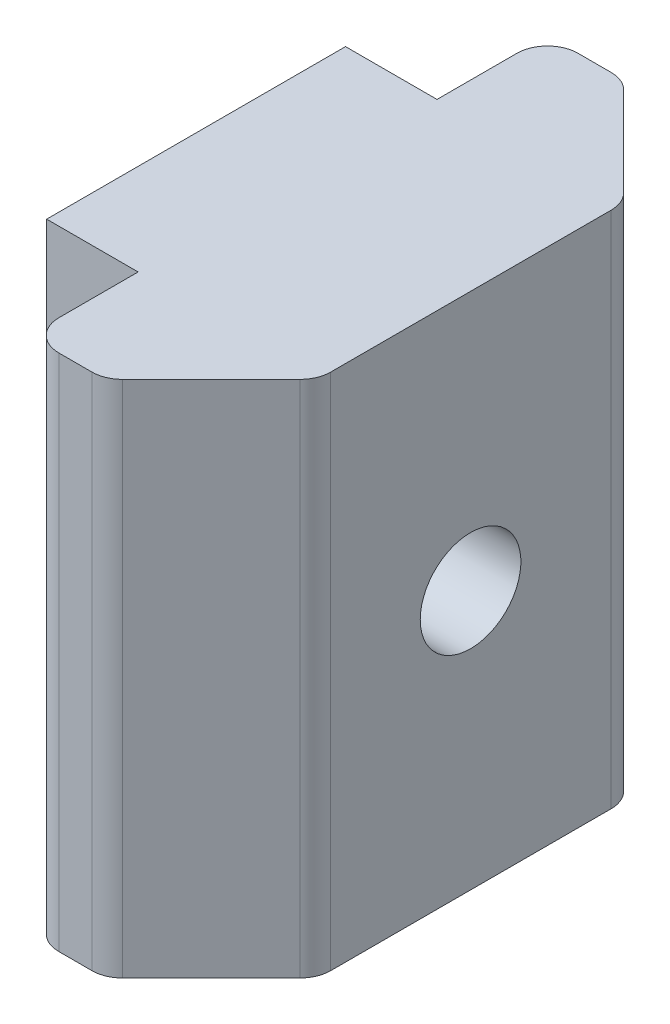
ISO-10303-21;
HEADER;
FILE_DESCRIPTION(('STEP AP214'),'2;1');
FILE_NAME('part.step','',(''),(''),'','','');
FILE_SCHEMA(('AUTOMOTIVE_DESIGN { 1 0 10303 214 1 1 1 1 }'));
ENDSEC;
DATA;
#1=APPLICATION_CONTEXT('core data for automotive mechanical design processes');
#2=APPLICATION_PROTOCOL_DEFINITION('international standard','automotive_design',2000,#1);
#3=PRODUCT_CONTEXT('',#1,'mechanical');
#4=PRODUCT('Part','Part','',(#3));
#5=PRODUCT_RELATED_PRODUCT_CATEGORY('part','',(#4));
#6=PRODUCT_DEFINITION_FORMATION('','',#4);
#7=PRODUCT_DEFINITION_CONTEXT('part definition',#1,'design');
#8=PRODUCT_DEFINITION('design','',#6,#7);
#9=PRODUCT_DEFINITION_SHAPE('','',#8);
#10=(LENGTH_UNIT() NAMED_UNIT(*) SI_UNIT(.MILLI.,.METRE.));
#11=(NAMED_UNIT(*) PLANE_ANGLE_UNIT() SI_UNIT($,.RADIAN.));
#12=(NAMED_UNIT(*) SI_UNIT($,.STERADIAN.) SOLID_ANGLE_UNIT());
#13=UNCERTAINTY_MEASURE_WITH_UNIT(LENGTH_MEASURE(1.E-05),#10,'distance_accuracy_value','');
#14=(GEOMETRIC_REPRESENTATION_CONTEXT(3) GLOBAL_UNCERTAINTY_ASSIGNED_CONTEXT((#13)) GLOBAL_UNIT_ASSIGNED_CONTEXT((#10,
#11,#12)) REPRESENTATION_CONTEXT('',''));
#15=CARTESIAN_POINT('',(0.,0.,0.));
#16=DIRECTION('',(0.,0.,1.));
#17=DIRECTION('',(1.,0.,0.));
#18=AXIS2_PLACEMENT_3D('',#15,#16,#17);
#19=CARTESIAN_POINT('',(8.42138897675098,17.,17.559438485096));
#20=DIRECTION('',(0.,-1.,0.));
#21=DIRECTION('',(0.,0.,-1.));
#22=AXIS2_PLACEMENT_3D('',#19,#20,#21);
#23=CYLINDRICAL_SURFACE('',#22,0.999999999999999);
#24=CARTESIAN_POINT('',(8.42138897675098,0.,17.559438485096));
#25=DIRECTION('',(0.,1.,0.));
#26=DIRECTION('',(0.,0.,1.));
#27=AXIS2_PLACEMENT_3D('',#24,#25,#26);
#28=CIRCLE('',#27,0.999999999999999);
#29=CARTESIAN_POINT('',(7.42138897675098,0.,17.5594385374559));
#30=VERTEX_POINT('',#29);
#31=CARTESIAN_POINT('',(8.42138915128389,0.,18.559438485096));
#32=VERTEX_POINT('',#31);
#33=EDGE_CURVE('E177',#30,#32,#28,.T.);
#34=ORIENTED_EDGE('',*,*,#33,.T.);
#35=DIRECTION('',(0.,-1.,0.));
#36=VECTOR('',#35,1.);
#37=CARTESIAN_POINT('',(8.42138915128389,17.,18.559438485096));
#38=LINE('',#37,#36);
#39=CARTESIAN_POINT('',(8.42138915128389,17.,18.559438485096));
#40=VERTEX_POINT('',#39);
#41=EDGE_CURVE('E11',#40,#32,#38,.T.);
#42=ORIENTED_EDGE('',*,*,#41,.F.);
#43=CARTESIAN_POINT('',(8.42138897675098,17.,17.559438485096));
#44=DIRECTION('',(0.,1.,0.));
#45=DIRECTION('',(0.,0.,1.));
#46=AXIS2_PLACEMENT_3D('',#43,#44,#45);
#47=CIRCLE('',#46,0.999999999999999);
#48=CARTESIAN_POINT('',(7.42138897675098,17.,17.5594385374559));
#49=VERTEX_POINT('',#48);
#50=EDGE_CURVE('E208',#49,#40,#47,.T.);
#51=ORIENTED_EDGE('',*,*,#50,.F.);
#52=DIRECTION('',(0.,-1.,0.));
#53=VECTOR('',#52,1.);
#54=CARTESIAN_POINT('',(7.42138897675098,17.,17.5594385374559));
#55=LINE('',#54,#53);
#56=EDGE_CURVE('E173',#49,#30,#55,.T.);
#57=ORIENTED_EDGE('',*,*,#56,.T.);
#58=EDGE_LOOP('',(#34,#42,#51,#57));
#59=FACE_BOUND('',#58,.T.);
#60=ADVANCED_FACE('F33',(#59),#23,.T.);
#61=CARTESIAN_POINT('',(9.50717615128388,17.,18.559438485096));
#62=DIRECTION('',(0.,0.,-1.));
#63=DIRECTION('',(-1.,0.,0.));
#64=AXIS2_PLACEMENT_3D('',#61,#62,#63);
#65=PLANE('',#64);
#66=DIRECTION('',(1.,0.,0.));
#67=VECTOR('',#66,1.);
#68=CARTESIAN_POINT('',(9.50717615128388,0.,18.559438485096));
#69=LINE('',#68,#67);
#70=CARTESIAN_POINT('',(9.50717615128388,0.,18.559438485096));
#71=VERTEX_POINT('',#70);
#72=EDGE_CURVE('E180',#32,#71,#69,.T.);
#73=ORIENTED_EDGE('',*,*,#72,.T.);
#74=DIRECTION('',(0.,-1.,0.));
#75=VECTOR('',#74,1.);
#76=CARTESIAN_POINT('',(9.50717615128388,17.,18.559438485096));
#77=LINE('',#76,#75);
#78=CARTESIAN_POINT('',(9.50717615128388,17.,18.559438485096));
#79=VERTEX_POINT('',#78);
#80=EDGE_CURVE('E41',#79,#71,#77,.T.);
#81=ORIENTED_EDGE('',*,*,#80,.F.);
#82=DIRECTION('',(1.,0.,0.));
#83=VECTOR('',#82,1.);
#84=CARTESIAN_POINT('',(9.50717615128388,17.,18.559438485096));
#85=LINE('',#84,#83);
#86=EDGE_CURVE('E116',#40,#79,#85,.T.);
#87=ORIENTED_EDGE('',*,*,#86,.F.);
#88=ORIENTED_EDGE('',*,*,#41,.T.);
#89=EDGE_LOOP('',(#73,#81,#87,#88));
#90=FACE_BOUND('',#89,.T.);
#91=ADVANCED_FACE('F306',(#90),#65,.F.);
#92=CARTESIAN_POINT('',(9.50717597675096,17.,17.559438485096));
#93=DIRECTION('',(0.,-1.,0.));
#94=DIRECTION('',(0.,0.,-1.));
#95=AXIS2_PLACEMENT_3D('',#92,#93,#94);
#96=CYLINDRICAL_SURFACE('',#95,0.999999999999999);
#97=CARTESIAN_POINT('',(9.50717597675096,0.,17.559438485096));
#98=DIRECTION('',(0.,1.,0.));
#99=DIRECTION('',(0.,0.,1.));
#100=AXIS2_PLACEMENT_3D('',#97,#98,#99);
#101=CIRCLE('',#100,0.999999999999999);
#102=CARTESIAN_POINT('',(10.2142827579375,0.,18.2665452662826));
#103=VERTEX_POINT('',#102);
#104=EDGE_CURVE('E183',#71,#103,#101,.T.);
#105=ORIENTED_EDGE('',*,*,#104,.T.);
#106=DIRECTION('',(0.,-1.,0.));
#107=VECTOR('',#106,1.);
#108=CARTESIAN_POINT('',(10.2142827579375,17.,18.2665452662826));
#109=LINE('',#108,#107);
#110=CARTESIAN_POINT('',(10.2142827579375,17.,18.2665452662826));
#111=VERTEX_POINT('',#110);
#112=EDGE_CURVE('E239',#111,#103,#109,.T.);
#113=ORIENTED_EDGE('',*,*,#112,.F.);
#114=CARTESIAN_POINT('',(9.50717597675096,17.,17.559438485096));
#115=DIRECTION('',(0.,1.,0.));
#116=DIRECTION('',(0.,0.,1.));
#117=AXIS2_PLACEMENT_3D('',#114,#115,#116);
#118=CIRCLE('',#117,0.999999999999999);
#119=EDGE_CURVE('E247',#79,#111,#118,.T.);
#120=ORIENTED_EDGE('',*,*,#119,.F.);
#121=ORIENTED_EDGE('',*,*,#80,.T.);
#122=EDGE_LOOP('',(#105,#113,#120,#121));
#123=FACE_BOUND('',#122,.T.);
#124=ADVANCED_FACE('F245',(#123),#96,.T.);
#125=CARTESIAN_POINT('',(10.2142827579375,17.,18.2665452662826));
#126=DIRECTION('',(-0.707106728093478,0.,-0.707106834279614));
#127=DIRECTION('',(-0.707106834279614,0.,0.707106728093478));
#128=AXIS2_PLACEMENT_3D('',#125,#126,#127);
#129=PLANE('',#128);
#130=DIRECTION('',(0.707106834279614,0.,-0.707106728093477));
#131=VECTOR('',#130,1.);
#132=CARTESIAN_POINT('',(10.2142827579375,0.,18.2665452662826));
#133=LINE('',#132,#131);
#134=CARTESIAN_POINT('',(13.1284959767511,0.,15.352332485096));
#135=VERTEX_POINT('',#134);
#136=EDGE_CURVE('E185',#103,#135,#133,.T.);
#137=ORIENTED_EDGE('',*,*,#136,.T.);
#138=DIRECTION('',(0.,-1.,0.));
#139=VECTOR('',#138,1.);
#140=CARTESIAN_POINT('',(13.1284959767511,17.,15.352332485096));
#141=LINE('',#140,#139);
#142=CARTESIAN_POINT('',(13.1284959767511,17.,15.352332485096));
#143=VERTEX_POINT('',#142);
#144=EDGE_CURVE('E236',#143,#135,#141,.T.);
#145=ORIENTED_EDGE('',*,*,#144,.F.);
#146=DIRECTION('',(0.707106834279614,0.,-0.707106728093477));
#147=VECTOR('',#146,1.);
#148=CARTESIAN_POINT('',(10.2142827579375,17.,18.2665452662826));
#149=LINE('',#148,#147);
#150=EDGE_CURVE('E265',#111,#143,#149,.T.);
#151=ORIENTED_EDGE('',*,*,#150,.F.);
#152=ORIENTED_EDGE('',*,*,#112,.T.);
#153=EDGE_LOOP('',(#137,#145,#151,#152));
#154=FACE_BOUND('',#153,.T.);
#155=ADVANCED_FACE('F256',(#154),#129,.F.);
#156=CARTESIAN_POINT('',(12.421388976752,17.,14.645225922722));
#157=DIRECTION('',(0.,-1.,0.));
#158=DIRECTION('',(0.,0.,-1.));
#159=AXIS2_PLACEMENT_3D('',#156,#157,#158);
#160=CYLINDRICAL_SURFACE('',#159,1.);
#161=CARTESIAN_POINT('',(12.421388976752,0.,14.645225922722));
#162=DIRECTION('',(0.,1.,0.));
#163=DIRECTION('',(0.,0.,1.));
#164=AXIS2_PLACEMENT_3D('',#161,#162,#163);
#165=CIRCLE('',#164,1.);
#166=CARTESIAN_POINT('',(13.421388976751,0.,14.645224485096));
#167=VERTEX_POINT('',#166);
#168=EDGE_CURVE('E187',#135,#167,#165,.T.);
#169=ORIENTED_EDGE('',*,*,#168,.T.);
#170=DIRECTION('',(0.,-1.,0.));
#171=VECTOR('',#170,1.);
#172=CARTESIAN_POINT('',(13.421388976751,17.,14.645224485096));
#173=LINE('',#172,#171);
#174=CARTESIAN_POINT('',(13.421388976751,17.,14.645224485096));
#175=VERTEX_POINT('',#174);
#176=EDGE_CURVE('E233',#175,#167,#173,.T.);
#177=ORIENTED_EDGE('',*,*,#176,.F.);
#178=CARTESIAN_POINT('',(12.421388976752,17.,14.645225922722));
#179=DIRECTION('',(0.,1.,0.));
#180=DIRECTION('',(0.,0.,1.));
#181=AXIS2_PLACEMENT_3D('',#178,#179,#180);
#182=CIRCLE('',#181,1.);
#183=EDGE_CURVE('E262',#143,#175,#182,.T.);
#184=ORIENTED_EDGE('',*,*,#183,.F.);
#185=ORIENTED_EDGE('',*,*,#144,.T.);
#186=EDGE_LOOP('',(#169,#177,#184,#185));
#187=FACE_BOUND('',#186,.T.);
#188=ADVANCED_FACE('F260',(#187),#160,.T.);
#189=CARTESIAN_POINT('',(13.421388976751,17.,14.645224485096));
#190=DIRECTION('',(-1.,0.,0.));
#191=DIRECTION('',(0.,0.,1.));
#192=AXIS2_PLACEMENT_3D('',#189,#190,#191);
#193=PLANE('',#192);
#194=CARTESIAN_POINT('',(13.421388976751,8.5,10.059438485096));
#195=DIRECTION('',(-1.,0.,0.));
#196=DIRECTION('',(0.,0.,1.));
#197=AXIS2_PLACEMENT_3D('',#194,#195,#196);
#198=CIRCLE('',#197,1.65);
#199=CARTESIAN_POINT('',(13.421388976751,8.5,11.709438485096));
#200=VERTEX_POINT('',#199);
#201=EDGE_CURVE('E181',#200,#200,#198,.T.);
#202=ORIENTED_EDGE('',*,*,#201,.T.);
#203=EDGE_LOOP('',(#202));
#204=FACE_BOUND('',#203,.T.);
#205=DIRECTION('',(0.,0.,-1.));
#206=VECTOR('',#205,1.);
#207=CARTESIAN_POINT('',(13.421388976751,0.,14.645224485096));
#208=LINE('',#207,#206);
#209=CARTESIAN_POINT('',(13.421388976751,0.,5.45164148509603));
#210=VERTEX_POINT('',#209);
#211=EDGE_CURVE('E189',#167,#210,#208,.T.);
#212=ORIENTED_EDGE('',*,*,#211,.T.);
#213=DIRECTION('',(0.,-1.,0.));
#214=VECTOR('',#213,1.);
#215=CARTESIAN_POINT('',(13.421388976751,17.,5.45164148509603));
#216=LINE('',#215,#214);
#217=CARTESIAN_POINT('',(13.421388976751,17.,5.45164148509603));
#218=VERTEX_POINT('',#217);
#219=EDGE_CURVE('E230',#218,#210,#216,.T.);
#220=ORIENTED_EDGE('',*,*,#219,.F.);
#221=DIRECTION('',(0.,0.,-1.));
#222=VECTOR('',#221,1.);
#223=CARTESIAN_POINT('',(13.421388976751,17.,14.645224485096));
#224=LINE('',#223,#222);
#225=EDGE_CURVE('E264',#175,#218,#224,.T.);
#226=ORIENTED_EDGE('',*,*,#225,.F.);
#227=ORIENTED_EDGE('',*,*,#176,.T.);
#228=EDGE_LOOP('',(#212,#220,#226,#227));
#229=FACE_BOUND('',#228,.T.);
#230=ADVANCED_FACE('F319',(#204,#229),#193,.F.);
#231=CARTESIAN_POINT('',(12.4213889767511,17.,5.45164204746913));
#232=DIRECTION('',(0.,-1.,0.));
#233=DIRECTION('',(0.,0.,-1.));
#234=AXIS2_PLACEMENT_3D('',#231,#232,#233);
#235=CYLINDRICAL_SURFACE('',#234,1.);
#236=CARTESIAN_POINT('',(12.4213889767511,0.,5.45164204746913));
#237=DIRECTION('',(0.,1.,0.));
#238=DIRECTION('',(0.,0.,1.));
#239=AXIS2_PLACEMENT_3D('',#236,#237,#238);
#240=CIRCLE('',#239,1.);
#241=CARTESIAN_POINT('',(13.1284959767511,0.,4.74453548509602));
#242=VERTEX_POINT('',#241);
#243=EDGE_CURVE('E191',#210,#242,#240,.T.);
#244=ORIENTED_EDGE('',*,*,#243,.T.);
#245=DIRECTION('',(0.,-1.,0.));
#246=VECTOR('',#245,1.);
#247=CARTESIAN_POINT('',(13.1284959767511,17.,4.74453548509602));
#248=LINE('',#247,#246);
#249=CARTESIAN_POINT('',(13.1284959767511,17.,4.74453548509602));
#250=VERTEX_POINT('',#249);
#251=EDGE_CURVE('E227',#250,#242,#248,.T.);
#252=ORIENTED_EDGE('',*,*,#251,.F.);
#253=CARTESIAN_POINT('',(12.4213889767511,17.,5.45164204746913));
#254=DIRECTION('',(0.,1.,0.));
#255=DIRECTION('',(0.,0.,1.));
#256=AXIS2_PLACEMENT_3D('',#253,#254,#255);
#257=CIRCLE('',#256,1.);
#258=EDGE_CURVE('E267',#218,#250,#257,.T.);
#259=ORIENTED_EDGE('',*,*,#258,.F.);
#260=ORIENTED_EDGE('',*,*,#219,.T.);
#261=EDGE_LOOP('',(#244,#252,#259,#260));
#262=FACE_BOUND('',#261,.T.);
#263=ADVANCED_FACE('F322',(#262),#235,.T.);
#264=CARTESIAN_POINT('',(10.2142827579375,17.,1.83032070390948));
#265=DIRECTION('',(-0.707106970734121,0.,0.707106591638924));
#266=DIRECTION('',(0.707106591638924,0.,0.707106970734121));
#267=AXIS2_PLACEMENT_3D('',#264,#265,#266);
#268=PLANE('',#267);
#269=DIRECTION('',(-0.707106591638924,0.,-0.707106970734121));
#270=VECTOR('',#269,1.);
#271=CARTESIAN_POINT('',(10.2142827579375,0.,1.83032070390948));
#272=LINE('',#271,#270);
#273=CARTESIAN_POINT('',(10.2142827579375,0.,1.83032070390948));
#274=VERTEX_POINT('',#273);
#275=EDGE_CURVE('E193',#242,#274,#272,.T.);
#276=ORIENTED_EDGE('',*,*,#275,.T.);
#277=DIRECTION('',(0.,-1.,0.));
#278=VECTOR('',#277,1.);
#279=CARTESIAN_POINT('',(10.2142827579375,17.,1.83032070390948));
#280=LINE('',#279,#278);
#281=CARTESIAN_POINT('',(10.2142827579375,17.,1.83032070390948));
#282=VERTEX_POINT('',#281);
#283=EDGE_CURVE('E224',#282,#274,#280,.T.);
#284=ORIENTED_EDGE('',*,*,#283,.F.);
#285=DIRECTION('',(-0.707106591638924,0.,-0.707106970734121));
#286=VECTOR('',#285,1.);
#287=CARTESIAN_POINT('',(10.2142827579375,17.,1.83032070390948));
#288=LINE('',#287,#286);
#289=EDGE_CURVE('E273',#250,#282,#288,.T.);
#290=ORIENTED_EDGE('',*,*,#289,.F.);
#291=ORIENTED_EDGE('',*,*,#251,.T.);
#292=EDGE_LOOP('',(#276,#284,#290,#291));
#293=FACE_BOUND('',#292,.T.);
#294=ADVANCED_FACE('F326',(#293),#268,.F.);
#295=CARTESIAN_POINT('',(9.50717597675096,17.,2.53742748509603));
#296=DIRECTION('',(0.,-1.,0.));
#297=DIRECTION('',(0.,0.,-1.));
#298=AXIS2_PLACEMENT_3D('',#295,#296,#297);
#299=CYLINDRICAL_SURFACE('',#298,1.);
#300=CARTESIAN_POINT('',(9.50717597675096,0.,2.53742748509603));
#301=DIRECTION('',(0.,1.,0.));
#302=DIRECTION('',(0.,0.,1.));
#303=AXIS2_PLACEMENT_3D('',#300,#301,#302);
#304=CIRCLE('',#303,1.);
#305=CARTESIAN_POINT('',(9.50717597675096,0.,1.53742748509603));
#306=VERTEX_POINT('',#305);
#307=EDGE_CURVE('E195',#274,#306,#304,.T.);
#308=ORIENTED_EDGE('',*,*,#307,.T.);
#309=DIRECTION('',(0.,-1.,0.));
#310=VECTOR('',#309,1.);
#311=CARTESIAN_POINT('',(9.50717597675096,17.,1.53742748509603));
#312=LINE('',#311,#310);
#313=CARTESIAN_POINT('',(9.50717597675096,17.,1.53742748509603));
#314=VERTEX_POINT('',#313);
#315=EDGE_CURVE('E221',#314,#306,#312,.T.);
#316=ORIENTED_EDGE('',*,*,#315,.F.);
#317=CARTESIAN_POINT('',(9.50717597675096,17.,2.53742748509603));
#318=DIRECTION('',(0.,1.,0.));
#319=DIRECTION('',(0.,0.,1.));
#320=AXIS2_PLACEMENT_3D('',#317,#318,#319);
#321=CIRCLE('',#320,1.);
#322=EDGE_CURVE('E275',#282,#314,#321,.T.);
#323=ORIENTED_EDGE('',*,*,#322,.F.);
#324=ORIENTED_EDGE('',*,*,#283,.T.);
#325=EDGE_LOOP('',(#308,#316,#323,#324));
#326=FACE_BOUND('',#325,.T.);
#327=ADVANCED_FACE('F330',(#326),#299,.T.);
#328=CARTESIAN_POINT('',(9.50717597675096,17.,1.53742748509603));
#329=DIRECTION('',(0.,0.,1.));
#330=DIRECTION('',(1.,0.,0.));
#331=AXIS2_PLACEMENT_3D('',#328,#329,#330);
#332=PLANE('',#331);
#333=DIRECTION('',(-1.,0.,0.));
#334=VECTOR('',#333,1.);
#335=CARTESIAN_POINT('',(9.50717597675096,0.,1.53742748509603));
#336=LINE('',#335,#334);
#337=CARTESIAN_POINT('',(8.42138897675098,0.,1.53742748509603));
#338=VERTEX_POINT('',#337);
#339=EDGE_CURVE('E197',#306,#338,#336,.T.);
#340=ORIENTED_EDGE('',*,*,#339,.T.);
#341=DIRECTION('',(0.,-1.,0.));
#342=VECTOR('',#341,1.);
#343=CARTESIAN_POINT('',(8.42138897675098,17.,1.53742748509603));
#344=LINE('',#343,#342);
#345=CARTESIAN_POINT('',(8.42138897675098,17.,1.53742748509603));
#346=VERTEX_POINT('',#345);
#347=EDGE_CURVE('E218',#346,#338,#344,.T.);
#348=ORIENTED_EDGE('',*,*,#347,.F.);
#349=DIRECTION('',(-1.,0.,0.));
#350=VECTOR('',#349,1.);
#351=CARTESIAN_POINT('',(9.50717597675096,17.,1.53742748509603));
#352=LINE('',#351,#350);
#353=EDGE_CURVE('E277',#314,#346,#352,.T.);
#354=ORIENTED_EDGE('',*,*,#353,.F.);
#355=ORIENTED_EDGE('',*,*,#315,.T.);
#356=EDGE_LOOP('',(#340,#348,#354,#355));
#357=FACE_BOUND('',#356,.T.);
#358=ADVANCED_FACE('F334',(#357),#332,.F.);
#359=CARTESIAN_POINT('',(8.42138897675098,17.,2.53742748509603));
#360=DIRECTION('',(0.,-1.,0.));
#361=DIRECTION('',(0.,0.,-1.));
#362=AXIS2_PLACEMENT_3D('',#359,#360,#361);
#363=CYLINDRICAL_SURFACE('',#362,1.);
#364=CARTESIAN_POINT('',(8.42138897675098,0.,2.53742748509603));
#365=DIRECTION('',(0.,1.,0.));
#366=DIRECTION('',(0.,0.,1.));
#367=AXIS2_PLACEMENT_3D('',#364,#365,#366);
#368=CIRCLE('',#367,1.);
#369=CARTESIAN_POINT('',(7.42138897675098,0.,2.53742753745591));
#370=VERTEX_POINT('',#369);
#371=EDGE_CURVE('E199',#338,#370,#368,.T.);
#372=ORIENTED_EDGE('',*,*,#371,.T.);
#373=DIRECTION('',(0.,-1.,0.));
#374=VECTOR('',#373,1.);
#375=CARTESIAN_POINT('',(7.42138897675098,17.,2.53742753745591));
#376=LINE('',#375,#374);
#377=CARTESIAN_POINT('',(7.42138897675098,17.,2.53742753745591));
#378=VERTEX_POINT('',#377);
#379=EDGE_CURVE('E215',#378,#370,#376,.T.);
#380=ORIENTED_EDGE('',*,*,#379,.F.);
#381=CARTESIAN_POINT('',(8.42138897675098,17.,2.53742748509603));
#382=DIRECTION('',(0.,1.,0.));
#383=DIRECTION('',(0.,0.,1.));
#384=AXIS2_PLACEMENT_3D('',#381,#382,#383);
#385=CIRCLE('',#384,1.);
#386=EDGE_CURVE('E279',#346,#378,#385,.T.);
#387=ORIENTED_EDGE('',*,*,#386,.F.);
#388=ORIENTED_EDGE('',*,*,#347,.T.);
#389=EDGE_LOOP('',(#372,#380,#387,#388));
#390=FACE_BOUND('',#389,.T.);
#391=ADVANCED_FACE('F338',(#390),#363,.T.);
#392=CARTESIAN_POINT('',(7.42138897675098,17.,5.15943848509603));
#393=DIRECTION('',(1.,0.,0.));
#394=DIRECTION('',(0.,0.,-1.));
#395=AXIS2_PLACEMENT_3D('',#392,#393,#394);
#396=PLANE('',#395);
#397=DIRECTION('',(0.,0.,1.));
#398=VECTOR('',#397,1.);
#399=CARTESIAN_POINT('',(7.42138897675098,0.,5.15943848509603));
#400=LINE('',#399,#398);
#401=CARTESIAN_POINT('',(7.42138897675098,0.,5.15943848509603));
#402=VERTEX_POINT('',#401);
#403=EDGE_CURVE('E201',#370,#402,#400,.T.);
#404=ORIENTED_EDGE('',*,*,#403,.T.);
#405=DIRECTION('',(0.,-1.,0.));
#406=VECTOR('',#405,1.);
#407=CARTESIAN_POINT('',(7.42138897675098,17.,5.15943848509603));
#408=LINE('',#407,#406);
#409=CARTESIAN_POINT('',(7.42138897675098,17.,5.15943848509603));
#410=VERTEX_POINT('',#409);
#411=EDGE_CURVE('E212',#410,#402,#408,.T.);
#412=ORIENTED_EDGE('',*,*,#411,.F.);
#413=DIRECTION('',(0.,0.,1.));
#414=VECTOR('',#413,1.);
#415=CARTESIAN_POINT('',(7.42138897675098,17.,5.15943848509603));
#416=LINE('',#415,#414);
#417=EDGE_CURVE('E281',#378,#410,#416,.T.);
#418=ORIENTED_EDGE('',*,*,#417,.F.);
#419=ORIENTED_EDGE('',*,*,#379,.T.);
#420=EDGE_LOOP('',(#404,#412,#418,#419));
#421=FACE_BOUND('',#420,.T.);
#422=ADVANCED_FACE('F287',(#421),#396,.F.);
#423=CARTESIAN_POINT('',(7.42138897675098,17.,5.15943848509603));
#424=DIRECTION('',(0.,0.,1.));
#425=DIRECTION('',(1.,0.,0.));
#426=AXIS2_PLACEMENT_3D('',#423,#424,#425);
#427=PLANE('',#426);
#428=DIRECTION('',(-1.,0.,0.));
#429=VECTOR('',#428,1.);
#430=CARTESIAN_POINT('',(7.42138897675098,0.,5.15943848509603));
#431=LINE('',#430,#429);
#432=CARTESIAN_POINT('',(4.421388976751,0.,5.15943848509603));
#433=VERTEX_POINT('',#432);
#434=EDGE_CURVE('E203',#402,#433,#431,.T.);
#435=ORIENTED_EDGE('',*,*,#434,.T.);
#436=DIRECTION('',(0.,-1.,0.));
#437=VECTOR('',#436,1.);
#438=CARTESIAN_POINT('',(4.421388976751,17.,5.15943848509603));
#439=LINE('',#438,#437);
#440=CARTESIAN_POINT('',(4.421388976751,17.,5.15943848509603));
#441=VERTEX_POINT('',#440);
#442=EDGE_CURVE('E168',#441,#433,#439,.T.);
#443=ORIENTED_EDGE('',*,*,#442,.F.);
#444=DIRECTION('',(-1.,0.,0.));
#445=VECTOR('',#444,1.);
#446=CARTESIAN_POINT('',(7.42138897675098,17.,5.15943848509603));
#447=LINE('',#446,#445);
#448=EDGE_CURVE('E159',#410,#441,#447,.T.);
#449=ORIENTED_EDGE('',*,*,#448,.F.);
#450=ORIENTED_EDGE('',*,*,#411,.T.);
#451=EDGE_LOOP('',(#435,#443,#449,#450));
#452=FACE_BOUND('',#451,.T.);
#453=ADVANCED_FACE('F291',(#452),#427,.F.);
#454=CARTESIAN_POINT('',(4.421388976751,17.,14.959438485096));
#455=DIRECTION('',(1.,0.,0.));
#456=DIRECTION('',(0.,0.,-1.));
#457=AXIS2_PLACEMENT_3D('',#454,#455,#456);
#458=PLANE('',#457);
#459=CARTESIAN_POINT('',(4.421388976751,8.5,10.059438485096));
#460=DIRECTION('',(-1.,0.,0.));
#461=DIRECTION('',(0.,0.,1.));
#462=AXIS2_PLACEMENT_3D('',#459,#460,#461);
#463=CIRCLE('',#462,1.65);
#464=CARTESIAN_POINT('',(4.421388976751,8.5,11.709438485096));
#465=VERTEX_POINT('',#464);
#466=EDGE_CURVE('E353',#465,#465,#463,.T.);
#467=ORIENTED_EDGE('',*,*,#466,.F.);
#468=EDGE_LOOP('',(#467));
#469=FACE_BOUND('',#468,.T.);
#470=DIRECTION('',(0.,0.,1.));
#471=VECTOR('',#470,1.);
#472=CARTESIAN_POINT('',(4.421388976751,0.,14.959438485096));
#473=LINE('',#472,#471);
#474=CARTESIAN_POINT('',(4.421388976751,0.,14.959438485096));
#475=VERTEX_POINT('',#474);
#476=EDGE_CURVE('E167',#433,#475,#473,.T.);
#477=ORIENTED_EDGE('',*,*,#476,.T.);
#478=DIRECTION('',(0.,-1.,0.));
#479=VECTOR('',#478,1.);
#480=CARTESIAN_POINT('',(4.421388976751,17.,14.959438485096));
#481=LINE('',#480,#479);
#482=CARTESIAN_POINT('',(4.421388976751,17.,14.959438485096));
#483=VERTEX_POINT('',#482);
#484=EDGE_CURVE('E164',#483,#475,#481,.T.);
#485=ORIENTED_EDGE('',*,*,#484,.F.);
#486=DIRECTION('',(0.,0.,1.));
#487=VECTOR('',#486,1.);
#488=CARTESIAN_POINT('',(4.421388976751,17.,14.959438485096));
#489=LINE('',#488,#487);
#490=EDGE_CURVE('E153',#441,#483,#489,.T.);
#491=ORIENTED_EDGE('',*,*,#490,.F.);
#492=ORIENTED_EDGE('',*,*,#442,.T.);
#493=EDGE_LOOP('',(#477,#485,#491,#492));
#494=FACE_BOUND('',#493,.T.);
#495=ADVANCED_FACE('F165',(#469,#494),#458,.F.);
#496=CARTESIAN_POINT('',(7.42138897675098,17.,14.959438485096));
#497=DIRECTION('',(0.,0.,-1.));
#498=DIRECTION('',(-1.,0.,0.));
#499=AXIS2_PLACEMENT_3D('',#496,#497,#498);
#500=PLANE('',#499);
#501=DIRECTION('',(1.,0.,0.));
#502=VECTOR('',#501,1.);
#503=CARTESIAN_POINT('',(7.42138897675098,0.,14.959438485096));
#504=LINE('',#503,#502);
#505=CARTESIAN_POINT('',(7.42138897675098,0.,14.959438485096));
#506=VERTEX_POINT('',#505);
#507=EDGE_CURVE('E102',#475,#506,#504,.T.);
#508=ORIENTED_EDGE('',*,*,#507,.T.);
#509=DIRECTION('',(0.,-1.,0.));
#510=VECTOR('',#509,1.);
#511=CARTESIAN_POINT('',(7.42138897675098,17.,14.959438485096));
#512=LINE('',#511,#510);
#513=CARTESIAN_POINT('',(7.42138897675098,17.,14.959438485096));
#514=VERTEX_POINT('',#513);
#515=EDGE_CURVE('E169',#514,#506,#512,.T.);
#516=ORIENTED_EDGE('',*,*,#515,.F.);
#517=DIRECTION('',(1.,0.,0.));
#518=VECTOR('',#517,1.);
#519=CARTESIAN_POINT('',(7.42138897675098,17.,14.959438485096));
#520=LINE('',#519,#518);
#521=EDGE_CURVE('E157',#483,#514,#520,.T.);
#522=ORIENTED_EDGE('',*,*,#521,.F.);
#523=ORIENTED_EDGE('',*,*,#484,.T.);
#524=EDGE_LOOP('',(#508,#516,#522,#523));
#525=FACE_BOUND('',#524,.T.);
#526=ADVANCED_FACE('F171',(#525),#500,.F.);
#527=CARTESIAN_POINT('',(7.42138897675098,17.,17.5594385374559));
#528=DIRECTION('',(1.,0.,0.));
#529=DIRECTION('',(0.,0.,-1.));
#530=AXIS2_PLACEMENT_3D('',#527,#528,#529);
#531=PLANE('',#530);
#532=DIRECTION('',(0.,0.,1.));
#533=VECTOR('',#532,1.);
#534=CARTESIAN_POINT('',(7.42138897675098,0.,17.5594385374559));
#535=LINE('',#534,#533);
#536=EDGE_CURVE('E108',#506,#30,#535,.T.);
#537=ORIENTED_EDGE('',*,*,#536,.T.);
#538=ORIENTED_EDGE('',*,*,#56,.F.);
#539=DIRECTION('',(0.,0.,1.));
#540=VECTOR('',#539,1.);
#541=CARTESIAN_POINT('',(7.42138897675098,17.,17.5594385374559));
#542=LINE('',#541,#540);
#543=EDGE_CURVE('E49',#514,#49,#542,.T.);
#544=ORIENTED_EDGE('',*,*,#543,.F.);
#545=ORIENTED_EDGE('',*,*,#515,.T.);
#546=EDGE_LOOP('',(#537,#538,#544,#545));
#547=FACE_BOUND('',#546,.T.);
#548=ADVANCED_FACE('F295',(#547),#531,.F.);
#549=CARTESIAN_POINT('',(8.42138897675098,17.,17.559438485096));
#550=DIRECTION('',(0.,1.,0.));
#551=DIRECTION('',(0.,0.,1.));
#552=AXIS2_PLACEMENT_3D('',#549,#550,#551);
#553=PLANE('',#552);
#554=ORIENTED_EDGE('',*,*,#50,.T.);
#555=ORIENTED_EDGE('',*,*,#86,.T.);
#556=ORIENTED_EDGE('',*,*,#119,.T.);
#557=ORIENTED_EDGE('',*,*,#150,.T.);
#558=ORIENTED_EDGE('',*,*,#183,.T.);
#559=ORIENTED_EDGE('',*,*,#225,.T.);
#560=ORIENTED_EDGE('',*,*,#258,.T.);
#561=ORIENTED_EDGE('',*,*,#289,.T.);
#562=ORIENTED_EDGE('',*,*,#322,.T.);
#563=ORIENTED_EDGE('',*,*,#353,.T.);
#564=ORIENTED_EDGE('',*,*,#386,.T.);
#565=ORIENTED_EDGE('',*,*,#417,.T.);
#566=ORIENTED_EDGE('',*,*,#448,.T.);
#567=ORIENTED_EDGE('',*,*,#490,.T.);
#568=ORIENTED_EDGE('',*,*,#521,.T.);
#569=ORIENTED_EDGE('',*,*,#543,.T.);
#570=EDGE_LOOP('',(#554,#555,#556,#557,#558,#559,#560,#561,#562,#563,#564,#565,#566,#567,#568,#569));
#571=FACE_BOUND('',#570,.T.);
#572=ADVANCED_FACE('F155',(#571),#553,.T.);
#573=CARTESIAN_POINT('',(8.42138897675098,0.,17.559438485096));
#574=DIRECTION('',(0.,1.,0.));
#575=DIRECTION('',(0.,0.,1.));
#576=AXIS2_PLACEMENT_3D('',#573,#574,#575);
#577=PLANE('',#576);
#578=ORIENTED_EDGE('',*,*,#33,.F.);
#579=ORIENTED_EDGE('',*,*,#536,.F.);
#580=ORIENTED_EDGE('',*,*,#507,.F.);
#581=ORIENTED_EDGE('',*,*,#476,.F.);
#582=ORIENTED_EDGE('',*,*,#434,.F.);
#583=ORIENTED_EDGE('',*,*,#403,.F.);
#584=ORIENTED_EDGE('',*,*,#371,.F.);
#585=ORIENTED_EDGE('',*,*,#339,.F.);
#586=ORIENTED_EDGE('',*,*,#307,.F.);
#587=ORIENTED_EDGE('',*,*,#275,.F.);
#588=ORIENTED_EDGE('',*,*,#243,.F.);
#589=ORIENTED_EDGE('',*,*,#211,.F.);
#590=ORIENTED_EDGE('',*,*,#168,.F.);
#591=ORIENTED_EDGE('',*,*,#136,.F.);
#592=ORIENTED_EDGE('',*,*,#104,.F.);
#593=ORIENTED_EDGE('',*,*,#72,.F.);
#594=EDGE_LOOP('',(#578,#579,#580,#581,#582,#583,#584,#585,#586,#587,#588,#589,#590,#591,#592,#593));
#595=FACE_BOUND('',#594,.T.);
#596=ADVANCED_FACE('F251',(#595),#577,.F.);
#597=CARTESIAN_POINT('',(4.421388976751,8.5,10.059438485096));
#598=DIRECTION('',(-1.,0.,0.));
#599=DIRECTION('',(0.,0.,1.));
#600=AXIS2_PLACEMENT_3D('',#597,#598,#599);
#601=CYLINDRICAL_SURFACE('',#600,1.65);
#602=ORIENTED_EDGE('',*,*,#201,.F.);
#603=EDGE_LOOP('',(#602));
#604=FACE_BOUND('',#603,.T.);
#605=ORIENTED_EDGE('',*,*,#466,.T.);
#606=EDGE_LOOP('',(#605));
#607=FACE_BOUND('',#606,.T.);
#608=ADVANCED_FACE('F363',(#604,#607),#601,.F.);
#609=CLOSED_SHELL('',(#60,#91,#124,#155,#188,#230,#263,#294,#327,#358,#391,#422,#453,#495,#526,
#548,#572,#596,#608));
#610=MANIFOLD_SOLID_BREP('B2',#609);
#611=ADVANCED_BREP_SHAPE_REPRESENTATION('',(#18,#610),#14);
#612=SHAPE_DEFINITION_REPRESENTATION(#9,#611);
ENDSEC;
END-ISO-10303-21;
